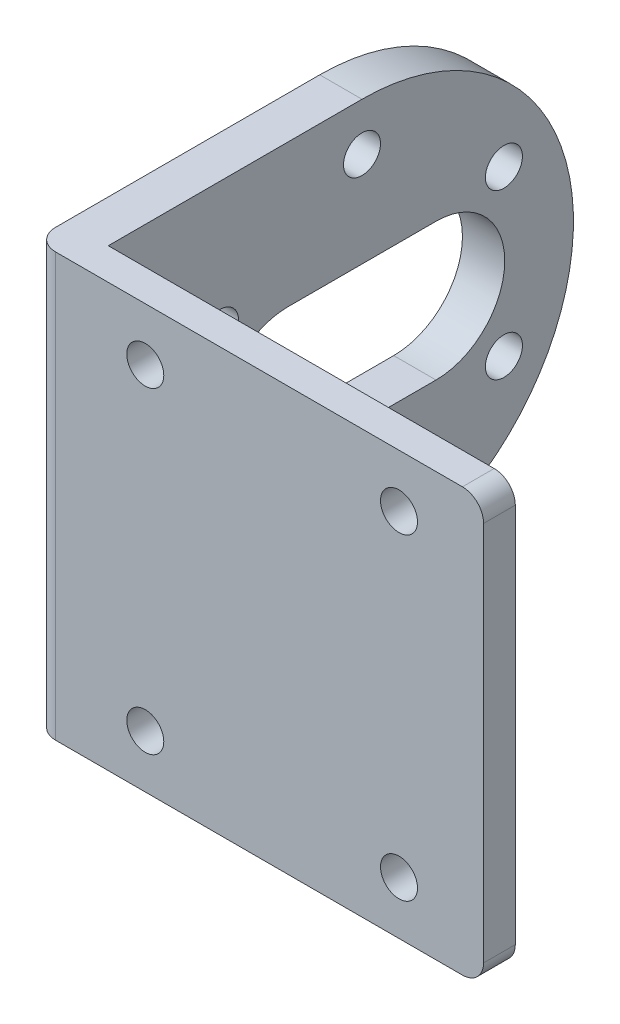
ISO-10303-21;
HEADER;
FILE_DESCRIPTION(('STEP AP214'),'2;1');
FILE_NAME('part.step','',(''),(''),'','','');
FILE_SCHEMA(('AUTOMOTIVE_DESIGN { 1 0 10303 214 1 1 1 1 }'));
ENDSEC;
DATA;
#1=APPLICATION_CONTEXT('core data for automotive mechanical design processes');
#2=APPLICATION_PROTOCOL_DEFINITION('international standard','automotive_design',2000,#1);
#3=PRODUCT_CONTEXT('',#1,'mechanical');
#4=PRODUCT('Part','Part','',(#3));
#5=PRODUCT_RELATED_PRODUCT_CATEGORY('part','',(#4));
#6=PRODUCT_DEFINITION_FORMATION('','',#4);
#7=PRODUCT_DEFINITION_CONTEXT('part definition',#1,'design');
#8=PRODUCT_DEFINITION('design','',#6,#7);
#9=PRODUCT_DEFINITION_SHAPE('','',#8);
#10=(LENGTH_UNIT() NAMED_UNIT(*) SI_UNIT(.MILLI.,.METRE.));
#11=(NAMED_UNIT(*) PLANE_ANGLE_UNIT() SI_UNIT($,.RADIAN.));
#12=(NAMED_UNIT(*) SI_UNIT($,.STERADIAN.) SOLID_ANGLE_UNIT());
#13=UNCERTAINTY_MEASURE_WITH_UNIT(LENGTH_MEASURE(1.E-05),#10,'distance_accuracy_value','');
#14=(GEOMETRIC_REPRESENTATION_CONTEXT(3) GLOBAL_UNCERTAINTY_ASSIGNED_CONTEXT((#13)) GLOBAL_UNIT_ASSIGNED_CONTEXT((#10,
#11,#12)) REPRESENTATION_CONTEXT('',''));
#15=CARTESIAN_POINT('',(0.,0.,0.));
#16=DIRECTION('',(0.,0.,1.));
#17=DIRECTION('',(1.,0.,0.));
#18=AXIS2_PLACEMENT_3D('',#15,#16,#17);
#19=CARTESIAN_POINT('',(3.,40.,-3.));
#20=DIRECTION('',(0.,0.,1.));
#21=DIRECTION('',(1.,0.,0.));
#22=AXIS2_PLACEMENT_3D('',#19,#20,#21);
#23=PLANE('',#22);
#24=CARTESIAN_POINT('',(34.5,35.,-3.));
#25=DIRECTION('',(0.,0.,1.));
#26=DIRECTION('',(1.,0.,0.));
#27=AXIS2_PLACEMENT_3D('',#24,#25,#26);
#28=CIRCLE('',#27,1.74999999999999);
#29=CARTESIAN_POINT('',(36.25,35.,-3.));
#30=VERTEX_POINT('',#29);
#31=EDGE_CURVE('E412',#30,#30,#28,.F.);
#32=ORIENTED_EDGE('',*,*,#31,.F.);
#33=EDGE_LOOP('',(#32));
#34=FACE_BOUND('',#33,.T.);
#35=CARTESIAN_POINT('',(10.5,4.99999999999983,-3.));
#36=DIRECTION('',(0.,0.,1.));
#37=DIRECTION('',(1.,0.,0.));
#38=AXIS2_PLACEMENT_3D('',#35,#36,#37);
#39=CIRCLE('',#38,1.75);
#40=CARTESIAN_POINT('',(12.25,4.99999999999983,-3.));
#41=VERTEX_POINT('',#40);
#42=EDGE_CURVE('E419',#41,#41,#39,.F.);
#43=ORIENTED_EDGE('',*,*,#42,.F.);
#44=EDGE_LOOP('',(#43));
#45=FACE_BOUND('',#44,.T.);
#46=CARTESIAN_POINT('',(10.5,34.9999999999998,-3.));
#47=DIRECTION('',(0.,0.,1.));
#48=DIRECTION('',(1.,0.,0.));
#49=AXIS2_PLACEMENT_3D('',#46,#47,#48);
#50=CIRCLE('',#49,1.74999999999999);
#51=CARTESIAN_POINT('',(12.25,34.9999999999998,-3.));
#52=VERTEX_POINT('',#51);
#53=EDGE_CURVE('E430',#52,#52,#50,.F.);
#54=ORIENTED_EDGE('',*,*,#53,.F.);
#55=EDGE_LOOP('',(#54));
#56=FACE_BOUND('',#55,.T.);
#57=CARTESIAN_POINT('',(34.5,5.,-3.));
#58=DIRECTION('',(0.,0.,1.));
#59=DIRECTION('',(1.,0.,0.));
#60=AXIS2_PLACEMENT_3D('',#57,#58,#59);
#61=CIRCLE('',#60,1.75);
#62=CARTESIAN_POINT('',(36.25,5.,-3.));
#63=VERTEX_POINT('',#62);
#64=EDGE_CURVE('E416',#63,#63,#61,.F.);
#65=ORIENTED_EDGE('',*,*,#64,.F.);
#66=EDGE_LOOP('',(#65));
#67=FACE_BOUND('',#66,.T.);
#68=DIRECTION('',(-1.,0.,0.));
#69=VECTOR('',#68,1.);
#70=CARTESIAN_POINT('',(3.,40.,-3.));
#71=LINE('',#70,#69);
#72=CARTESIAN_POINT('',(40.5,40.,-3.));
#73=VERTEX_POINT('',#72);
#74=CARTESIAN_POINT('',(3.99999999999999,40.,-3.));
#75=VERTEX_POINT('',#74);
#76=EDGE_CURVE('E198',#73,#75,#71,.T.);
#77=ORIENTED_EDGE('',*,*,#76,.F.);
#78=CARTESIAN_POINT('',(40.5,38.,-3.));
#79=DIRECTION('',(0.,0.,1.));
#80=DIRECTION('',(1.,0.,0.));
#81=AXIS2_PLACEMENT_3D('',#78,#79,#80);
#82=CIRCLE('',#81,2.);
#83=CARTESIAN_POINT('',(42.5,38.,-3.));
#84=VERTEX_POINT('',#83);
#85=EDGE_CURVE('E221',#73,#84,#82,.F.);
#86=ORIENTED_EDGE('',*,*,#85,.T.);
#87=DIRECTION('',(0.,-1.,0.));
#88=VECTOR('',#87,1.);
#89=CARTESIAN_POINT('',(42.5,40.,-3.));
#90=LINE('',#89,#88);
#91=CARTESIAN_POINT('',(42.5,2.,-3.));
#92=VERTEX_POINT('',#91);
#93=EDGE_CURVE('E204',#84,#92,#90,.T.);
#94=ORIENTED_EDGE('',*,*,#93,.T.);
#95=CARTESIAN_POINT('',(40.5,2.,-3.));
#96=DIRECTION('',(0.,0.,1.));
#97=DIRECTION('',(1.,0.,0.));
#98=AXIS2_PLACEMENT_3D('',#95,#96,#97);
#99=CIRCLE('',#98,2.);
#100=CARTESIAN_POINT('',(40.5,0.,-3.));
#101=VERTEX_POINT('',#100);
#102=EDGE_CURVE('E225',#92,#101,#99,.F.);
#103=ORIENTED_EDGE('',*,*,#102,.T.);
#104=DIRECTION('',(-1.,0.,0.));
#105=VECTOR('',#104,1.);
#106=CARTESIAN_POINT('',(3.,0.,-3.));
#107=LINE('',#106,#105);
#108=CARTESIAN_POINT('',(3.99999999999999,0.,-3.));
#109=VERTEX_POINT('',#108);
#110=EDGE_CURVE('E206',#101,#109,#107,.T.);
#111=ORIENTED_EDGE('',*,*,#110,.T.);
#112=DIRECTION('',(0.,-1.,0.));
#113=VECTOR('',#112,1.);
#114=CARTESIAN_POINT('',(4.,40.,-3.));
#115=LINE('',#114,#113);
#116=EDGE_CURVE('E181',#75,#109,#115,.T.);
#117=ORIENTED_EDGE('',*,*,#116,.F.);
#118=EDGE_LOOP('',(#77,#86,#94,#103,#111,#117));
#119=FACE_BOUND('',#118,.T.);
#120=ADVANCED_FACE('F40',(#34,#45,#56,#67,#119),#23,.F.);
#121=CARTESIAN_POINT('',(42.5,40.,0.));
#122=DIRECTION('',(0.,0.,-1.));
#123=DIRECTION('',(-1.,0.,0.));
#124=AXIS2_PLACEMENT_3D('',#121,#122,#123);
#125=PLANE('',#124);
#126=CARTESIAN_POINT('',(34.5,35.,0.));
#127=DIRECTION('',(0.,0.,1.));
#128=DIRECTION('',(-1.,0.,0.));
#129=AXIS2_PLACEMENT_3D('',#126,#127,#128);
#130=CIRCLE('',#129,1.74999999999999);
#131=CARTESIAN_POINT('',(32.75,35.,0.));
#132=VERTEX_POINT('',#131);
#133=EDGE_CURVE('E415',#132,#132,#130,.T.);
#134=ORIENTED_EDGE('',*,*,#133,.F.);
#135=EDGE_LOOP('',(#134));
#136=FACE_BOUND('',#135,.T.);
#137=CARTESIAN_POINT('',(10.5,4.99999999999983,0.));
#138=DIRECTION('',(0.,0.,1.));
#139=DIRECTION('',(1.,0.,0.));
#140=AXIS2_PLACEMENT_3D('',#137,#138,#139);
#141=CIRCLE('',#140,1.75);
#142=CARTESIAN_POINT('',(12.25,4.99999999999983,0.));
#143=VERTEX_POINT('',#142);
#144=EDGE_CURVE('E424',#143,#143,#141,.T.);
#145=ORIENTED_EDGE('',*,*,#144,.F.);
#146=EDGE_LOOP('',(#145));
#147=FACE_BOUND('',#146,.T.);
#148=CARTESIAN_POINT('',(10.5,34.9999999999998,0.));
#149=DIRECTION('',(0.,0.,1.));
#150=DIRECTION('',(-1.,0.,0.));
#151=AXIS2_PLACEMENT_3D('',#148,#149,#150);
#152=CIRCLE('',#151,1.74999999999999);
#153=CARTESIAN_POINT('',(8.75,34.9999999999998,0.));
#154=VERTEX_POINT('',#153);
#155=EDGE_CURVE('E501',#154,#154,#152,.T.);
#156=ORIENTED_EDGE('',*,*,#155,.F.);
#157=EDGE_LOOP('',(#156));
#158=FACE_BOUND('',#157,.T.);
#159=CARTESIAN_POINT('',(34.5,5.,0.));
#160=DIRECTION('',(0.,0.,1.));
#161=DIRECTION('',(1.,0.,0.));
#162=AXIS2_PLACEMENT_3D('',#159,#160,#161);
#163=CIRCLE('',#162,1.75);
#164=CARTESIAN_POINT('',(36.25,5.,0.));
#165=VERTEX_POINT('',#164);
#166=EDGE_CURVE('E414',#165,#165,#163,.T.);
#167=ORIENTED_EDGE('',*,*,#166,.F.);
#168=EDGE_LOOP('',(#167));
#169=FACE_BOUND('',#168,.T.);
#170=DIRECTION('',(0.,-1.,0.));
#171=VECTOR('',#170,1.);
#172=CARTESIAN_POINT('',(42.5,40.,0.));
#173=LINE('',#172,#171);
#174=CARTESIAN_POINT('',(42.5,38.,0.));
#175=VERTEX_POINT('',#174);
#176=CARTESIAN_POINT('',(42.5,2.,0.));
#177=VERTEX_POINT('',#176);
#178=EDGE_CURVE('E212',#175,#177,#173,.T.);
#179=ORIENTED_EDGE('',*,*,#178,.F.);
#180=CARTESIAN_POINT('',(40.5,38.,0.));
#181=DIRECTION('',(0.,0.,-1.));
#182=DIRECTION('',(-1.,0.,0.));
#183=AXIS2_PLACEMENT_3D('',#180,#181,#182);
#184=CIRCLE('',#183,2.);
#185=CARTESIAN_POINT('',(40.5,40.,0.));
#186=VERTEX_POINT('',#185);
#187=EDGE_CURVE('E237',#175,#186,#184,.F.);
#188=ORIENTED_EDGE('',*,*,#187,.T.);
#189=DIRECTION('',(1.,0.,0.));
#190=VECTOR('',#189,1.);
#191=CARTESIAN_POINT('',(42.5,40.,0.));
#192=LINE('',#191,#190);
#193=CARTESIAN_POINT('',(2.,40.,0.));
#194=VERTEX_POINT('',#193);
#195=EDGE_CURVE('E193',#194,#186,#192,.T.);
#196=ORIENTED_EDGE('',*,*,#195,.F.);
#197=DIRECTION('',(0.,-1.,0.));
#198=VECTOR('',#197,1.);
#199=CARTESIAN_POINT('',(2.,40.,0.));
#200=LINE('',#199,#198);
#201=CARTESIAN_POINT('',(2.,0.,0.));
#202=VERTEX_POINT('',#201);
#203=EDGE_CURVE('E231',#194,#202,#200,.T.);
#204=ORIENTED_EDGE('',*,*,#203,.T.);
#205=DIRECTION('',(1.,0.,0.));
#206=VECTOR('',#205,1.);
#207=CARTESIAN_POINT('',(42.5,0.,0.));
#208=LINE('',#207,#206);
#209=CARTESIAN_POINT('',(40.5,0.,0.));
#210=VERTEX_POINT('',#209);
#211=EDGE_CURVE('E195',#202,#210,#208,.T.);
#212=ORIENTED_EDGE('',*,*,#211,.T.);
#213=CARTESIAN_POINT('',(40.5,2.,0.));
#214=DIRECTION('',(0.,0.,-1.));
#215=DIRECTION('',(-1.,0.,0.));
#216=AXIS2_PLACEMENT_3D('',#213,#214,#215);
#217=CIRCLE('',#216,2.);
#218=EDGE_CURVE('E232',#210,#177,#217,.F.);
#219=ORIENTED_EDGE('',*,*,#218,.T.);
#220=EDGE_LOOP('',(#179,#188,#196,#204,#212,#219));
#221=FACE_BOUND('',#220,.T.);
#222=ADVANCED_FACE('F242',(#136,#147,#158,#169,#221),#125,.F.);
#223=CARTESIAN_POINT('',(42.5,40.,-3.));
#224=DIRECTION('',(-1.,0.,0.));
#225=DIRECTION('',(0.,0.,1.));
#226=AXIS2_PLACEMENT_3D('',#223,#224,#225);
#227=PLANE('',#226);
#228=ORIENTED_EDGE('',*,*,#93,.F.);
#229=DIRECTION('',(0.,0.,-1.));
#230=VECTOR('',#229,1.);
#231=CARTESIAN_POINT('',(42.5,38.,-3.));
#232=LINE('',#231,#230);
#233=EDGE_CURVE('E228',#84,#175,#232,.F.);
#234=ORIENTED_EDGE('',*,*,#233,.T.);
#235=ORIENTED_EDGE('',*,*,#178,.T.);
#236=DIRECTION('',(0.,0.,-1.));
#237=VECTOR('',#236,1.);
#238=CARTESIAN_POINT('',(42.5,2.,-3.));
#239=LINE('',#238,#237);
#240=EDGE_CURVE('E226',#177,#92,#239,.T.);
#241=ORIENTED_EDGE('',*,*,#240,.T.);
#242=EDGE_LOOP('',(#228,#234,#235,#241));
#243=FACE_BOUND('',#242,.T.);
#244=ADVANCED_FACE('F258',(#243),#227,.F.);
#245=CARTESIAN_POINT('',(0.,40.,0.));
#246=DIRECTION('',(1.,0.,0.));
#247=DIRECTION('',(0.,0.,-1.));
#248=AXIS2_PLACEMENT_3D('',#245,#246,#247);
#249=PLANE('',#248);
#250=CARTESIAN_POINT('',(0.,4.5,-27.));
#251=DIRECTION('',(1.,0.,0.));
#252=DIRECTION('',(0.,0.,-1.));
#253=AXIS2_PLACEMENT_3D('',#250,#251,#252);
#254=CIRCLE('',#253,1.75);
#255=CARTESIAN_POINT('',(0.,4.5,-28.75));
#256=VERTEX_POINT('',#255);
#257=EDGE_CURVE('E169',#256,#256,#254,.T.);
#258=ORIENTED_EDGE('',*,*,#257,.T.);
#259=EDGE_LOOP('',(#258));
#260=FACE_BOUND('',#259,.T.);
#261=CARTESIAN_POINT('',(0.,12.2499999999998,-40.4233937586587));
#262=DIRECTION('',(1.,0.,0.));
#263=DIRECTION('',(0.,0.,-1.));
#264=AXIS2_PLACEMENT_3D('',#261,#262,#263);
#265=CIRCLE('',#264,1.75);
#266=CARTESIAN_POINT('',(0.,12.2499999999998,-42.1733937586587));
#267=VERTEX_POINT('',#266);
#268=EDGE_CURVE('E438',#267,#267,#265,.T.);
#269=ORIENTED_EDGE('',*,*,#268,.T.);
#270=EDGE_LOOP('',(#269));
#271=FACE_BOUND('',#270,.T.);
#272=CARTESIAN_POINT('',(0.,27.7499999999999,-40.4233937586589));
#273=DIRECTION('',(1.,0.,0.));
#274=DIRECTION('',(0.,0.,-1.));
#275=AXIS2_PLACEMENT_3D('',#272,#273,#274);
#276=CIRCLE('',#275,1.75);
#277=CARTESIAN_POINT('',(0.,27.7499999999999,-42.1733937586589));
#278=VERTEX_POINT('',#277);
#279=EDGE_CURVE('E458',#278,#278,#276,.T.);
#280=ORIENTED_EDGE('',*,*,#279,.T.);
#281=EDGE_LOOP('',(#280));
#282=FACE_BOUND('',#281,.T.);
#283=CARTESIAN_POINT('',(0.,35.5,-27.0000000000001));
#284=DIRECTION('',(1.,0.,0.));
#285=DIRECTION('',(0.,0.,-1.));
#286=AXIS2_PLACEMENT_3D('',#283,#284,#285);
#287=CIRCLE('',#286,1.75);
#288=CARTESIAN_POINT('',(0.,35.5,-28.7500000000001));
#289=VERTEX_POINT('',#288);
#290=EDGE_CURVE('E454',#289,#289,#287,.T.);
#291=ORIENTED_EDGE('',*,*,#290,.T.);
#292=EDGE_LOOP('',(#291));
#293=FACE_BOUND('',#292,.T.);
#294=CARTESIAN_POINT('',(0.,27.7500000000001,-13.5766062413412));
#295=DIRECTION('',(1.,0.,0.));
#296=DIRECTION('',(0.,0.,-1.));
#297=AXIS2_PLACEMENT_3D('',#294,#295,#296);
#298=CIRCLE('',#297,1.75);
#299=CARTESIAN_POINT('',(0.,27.7500000000001,-15.3266062413412));
#300=VERTEX_POINT('',#299);
#301=EDGE_CURVE('E448',#300,#300,#298,.T.);
#302=ORIENTED_EDGE('',*,*,#301,.T.);
#303=EDGE_LOOP('',(#302));
#304=FACE_BOUND('',#303,.T.);
#305=CARTESIAN_POINT('',(0.,12.25,-13.5766062413412));
#306=DIRECTION('',(1.,0.,0.));
#307=DIRECTION('',(0.,0.,-1.));
#308=AXIS2_PLACEMENT_3D('',#305,#306,#307);
#309=CIRCLE('',#308,1.75);
#310=CARTESIAN_POINT('',(0.,12.25,-15.3266062413412));
#311=VERTEX_POINT('',#310);
#312=EDGE_CURVE('E437',#311,#311,#309,.T.);
#313=ORIENTED_EDGE('',*,*,#312,.T.);
#314=EDGE_LOOP('',(#313));
#315=FACE_BOUND('',#314,.T.);
#316=DIRECTION('',(0.,0.,-1.));
#317=VECTOR('',#316,1.);
#318=CARTESIAN_POINT('',(0.,13.5,-20.));
#319=LINE('',#318,#317);
#320=CARTESIAN_POINT('',(0.,13.5,-20.));
#321=VERTEX_POINT('',#320);
#322=CARTESIAN_POINT('',(0.,13.5,-34.));
#323=VERTEX_POINT('',#322);
#324=EDGE_CURVE('E142',#321,#323,#319,.T.);
#325=ORIENTED_EDGE('',*,*,#324,.T.);
#326=CARTESIAN_POINT('',(0.,20.,-34.));
#327=DIRECTION('',(1.,0.,0.));
#328=DIRECTION('',(0.,0.,1.));
#329=AXIS2_PLACEMENT_3D('',#326,#327,#328);
#330=CIRCLE('',#329,6.5);
#331=CARTESIAN_POINT('',(0.,26.5,-34.));
#332=VERTEX_POINT('',#331);
#333=EDGE_CURVE('E133',#323,#332,#330,.T.);
#334=ORIENTED_EDGE('',*,*,#333,.T.);
#335=DIRECTION('',(0.,0.,1.));
#336=VECTOR('',#335,1.);
#337=CARTESIAN_POINT('',(0.,26.5,-20.));
#338=LINE('',#337,#336);
#339=CARTESIAN_POINT('',(0.,26.5,-20.));
#340=VERTEX_POINT('',#339);
#341=EDGE_CURVE('E148',#332,#340,#338,.T.);
#342=ORIENTED_EDGE('',*,*,#341,.T.);
#343=CARTESIAN_POINT('',(0.,20.,-20.));
#344=DIRECTION('',(1.,0.,0.));
#345=DIRECTION('',(0.,0.,-1.));
#346=AXIS2_PLACEMENT_3D('',#343,#344,#345);
#347=CIRCLE('',#346,6.5);
#348=EDGE_CURVE('E147',#340,#321,#347,.T.);
#349=ORIENTED_EDGE('',*,*,#348,.T.);
#350=EDGE_LOOP('',(#325,#334,#342,#349));
#351=FACE_BOUND('',#350,.T.);
#352=DIRECTION('',(0.,0.,1.));
#353=VECTOR('',#352,1.);
#354=CARTESIAN_POINT('',(0.,0.,0.));
#355=LINE('',#354,#353);
#356=CARTESIAN_POINT('',(0.,0.,-27.));
#357=VERTEX_POINT('',#356);
#358=CARTESIAN_POINT('',(0.,0.,-2.));
#359=VERTEX_POINT('',#358);
#360=EDGE_CURVE('E197',#357,#359,#355,.T.);
#361=ORIENTED_EDGE('',*,*,#360,.T.);
#362=DIRECTION('',(0.,-1.,0.));
#363=VECTOR('',#362,1.);
#364=CARTESIAN_POINT('',(0.,40.,-2.));
#365=LINE('',#364,#363);
#366=CARTESIAN_POINT('',(0.,40.,-2.));
#367=VERTEX_POINT('',#366);
#368=EDGE_CURVE('E11',#359,#367,#365,.F.);
#369=ORIENTED_EDGE('',*,*,#368,.T.);
#370=DIRECTION('',(0.,0.,1.));
#371=VECTOR('',#370,1.);
#372=CARTESIAN_POINT('',(0.,40.,0.));
#373=LINE('',#372,#371);
#374=CARTESIAN_POINT('',(0.,40.,-27.));
#375=VERTEX_POINT('',#374);
#376=EDGE_CURVE('E203',#375,#367,#373,.T.);
#377=ORIENTED_EDGE('',*,*,#376,.F.);
#378=CARTESIAN_POINT('',(0.,20.,-27.));
#379=DIRECTION('',(1.,0.,0.));
#380=DIRECTION('',(0.,0.,1.));
#381=AXIS2_PLACEMENT_3D('',#378,#379,#380);
#382=CIRCLE('',#381,20.);
#383=EDGE_CURVE('E188',#357,#375,#382,.T.);
#384=ORIENTED_EDGE('',*,*,#383,.F.);
#385=EDGE_LOOP('',(#361,#369,#377,#384));
#386=FACE_BOUND('',#385,.T.);
#387=ADVANCED_FACE('F155',(#260,#271,#282,#293,#304,#315,#351,#386),#249,.F.);
#388=CARTESIAN_POINT('',(0.,40.,0.));
#389=DIRECTION('',(0.,-1.,0.));
#390=DIRECTION('',(0.,0.,-1.));
#391=AXIS2_PLACEMENT_3D('',#388,#389,#390);
#392=PLANE('',#391);
#393=ORIENTED_EDGE('',*,*,#195,.T.);
#394=DIRECTION('',(0.,0.,-1.));
#395=VECTOR('',#394,1.);
#396=CARTESIAN_POINT('',(40.5,40.,0.));
#397=LINE('',#396,#395);
#398=EDGE_CURVE('E218',#186,#73,#397,.T.);
#399=ORIENTED_EDGE('',*,*,#398,.T.);
#400=ORIENTED_EDGE('',*,*,#76,.T.);
#401=DIRECTION('',(0.,0.,1.));
#402=VECTOR('',#401,1.);
#403=CARTESIAN_POINT('',(3.99999999999999,40.,-27.));
#404=LINE('',#403,#402);
#405=CARTESIAN_POINT('',(3.99999999999999,40.,-27.));
#406=VERTEX_POINT('',#405);
#407=EDGE_CURVE('E179',#406,#75,#404,.T.);
#408=ORIENTED_EDGE('',*,*,#407,.F.);
#409=DIRECTION('',(-1.,0.,0.));
#410=VECTOR('',#409,1.);
#411=CARTESIAN_POINT('',(0.,40.,-27.));
#412=LINE('',#411,#410);
#413=EDGE_CURVE('E200',#406,#375,#412,.T.);
#414=ORIENTED_EDGE('',*,*,#413,.T.);
#415=ORIENTED_EDGE('',*,*,#376,.T.);
#416=CARTESIAN_POINT('',(2.,40.,-2.));
#417=DIRECTION('',(0.,-1.,0.));
#418=DIRECTION('',(0.,0.,-1.));
#419=AXIS2_PLACEMENT_3D('',#416,#417,#418);
#420=CIRCLE('',#419,2.);
#421=EDGE_CURVE('E220',#367,#194,#420,.F.);
#422=ORIENTED_EDGE('',*,*,#421,.T.);
#423=EDGE_LOOP('',(#393,#399,#400,#408,#414,#415,#422));
#424=FACE_BOUND('',#423,.T.);
#425=ADVANCED_FACE('F248',(#424),#392,.F.);
#426=CARTESIAN_POINT('',(0.,0.,0.));
#427=DIRECTION('',(0.,-1.,0.));
#428=DIRECTION('',(0.,0.,-1.));
#429=AXIS2_PLACEMENT_3D('',#426,#427,#428);
#430=PLANE('',#429);
#431=ORIENTED_EDGE('',*,*,#110,.F.);
#432=DIRECTION('',(0.,0.,-1.));
#433=VECTOR('',#432,1.);
#434=CARTESIAN_POINT('',(40.5,0.,0.));
#435=LINE('',#434,#433);
#436=EDGE_CURVE('E44',#101,#210,#435,.F.);
#437=ORIENTED_EDGE('',*,*,#436,.T.);
#438=ORIENTED_EDGE('',*,*,#211,.F.);
#439=CARTESIAN_POINT('',(2.,0.,-2.));
#440=DIRECTION('',(0.,-1.,0.));
#441=DIRECTION('',(0.,0.,-1.));
#442=AXIS2_PLACEMENT_3D('',#439,#440,#441);
#443=CIRCLE('',#442,2.);
#444=EDGE_CURVE('E55',#202,#359,#443,.T.);
#445=ORIENTED_EDGE('',*,*,#444,.T.);
#446=ORIENTED_EDGE('',*,*,#360,.F.);
#447=DIRECTION('',(-1.,0.,0.));
#448=VECTOR('',#447,1.);
#449=CARTESIAN_POINT('',(0.,0.,-27.));
#450=LINE('',#449,#448);
#451=CARTESIAN_POINT('',(3.99999999999999,0.,-27.));
#452=VERTEX_POINT('',#451);
#453=EDGE_CURVE('E208',#452,#357,#450,.T.);
#454=ORIENTED_EDGE('',*,*,#453,.F.);
#455=DIRECTION('',(0.,0.,-1.));
#456=VECTOR('',#455,1.);
#457=CARTESIAN_POINT('',(4.,0.,-3.));
#458=LINE('',#457,#456);
#459=EDGE_CURVE('E186',#109,#452,#458,.T.);
#460=ORIENTED_EDGE('',*,*,#459,.F.);
#461=EDGE_LOOP('',(#431,#437,#438,#445,#446,#454,#460));
#462=FACE_BOUND('',#461,.T.);
#463=ADVANCED_FACE('F265',(#462),#430,.T.);
#464=CARTESIAN_POINT('',(0.,20.,-27.));
#465=DIRECTION('',(1.,0.,0.));
#466=DIRECTION('',(0.,0.,-1.));
#467=AXIS2_PLACEMENT_3D('',#464,#465,#466);
#468=CYLINDRICAL_SURFACE('',#467,20.);
#469=ORIENTED_EDGE('',*,*,#413,.F.);
#470=CARTESIAN_POINT('',(3.99999999999999,20.,-27.));
#471=DIRECTION('',(1.,0.,0.));
#472=DIRECTION('',(0.,0.,1.));
#473=AXIS2_PLACEMENT_3D('',#470,#471,#472);
#474=CIRCLE('',#473,20.);
#475=EDGE_CURVE('E173',#452,#406,#474,.T.);
#476=ORIENTED_EDGE('',*,*,#475,.F.);
#477=ORIENTED_EDGE('',*,*,#453,.T.);
#478=ORIENTED_EDGE('',*,*,#383,.T.);
#479=EDGE_LOOP('',(#469,#476,#477,#478));
#480=FACE_BOUND('',#479,.T.);
#481=ADVANCED_FACE('F270',(#480),#468,.T.);
#482=CARTESIAN_POINT('',(3.99999999999999,20.,-27.));
#483=DIRECTION('',(-1.,0.,0.));
#484=DIRECTION('',(0.,0.,1.));
#485=AXIS2_PLACEMENT_3D('',#482,#483,#484);
#486=PLANE('',#485);
#487=CARTESIAN_POINT('',(3.99999999999999,4.5,-27.));
#488=DIRECTION('',(1.,0.,0.));
#489=DIRECTION('',(0.,0.,-1.));
#490=AXIS2_PLACEMENT_3D('',#487,#488,#489);
#491=CIRCLE('',#490,1.75);
#492=CARTESIAN_POINT('',(3.99999999999999,4.5,-28.75));
#493=VERTEX_POINT('',#492);
#494=EDGE_CURVE('E434',#493,#493,#491,.T.);
#495=ORIENTED_EDGE('',*,*,#494,.F.);
#496=EDGE_LOOP('',(#495));
#497=FACE_BOUND('',#496,.T.);
#498=CARTESIAN_POINT('',(3.99999999999999,12.2499999999998,-40.4233937586587));
#499=DIRECTION('',(1.,0.,0.));
#500=DIRECTION('',(0.,0.,-1.));
#501=AXIS2_PLACEMENT_3D('',#498,#499,#500);
#502=CIRCLE('',#501,1.75);
#503=CARTESIAN_POINT('',(3.99999999999999,12.2499999999998,-42.1733937586587));
#504=VERTEX_POINT('',#503);
#505=EDGE_CURVE('E435',#504,#504,#502,.T.);
#506=ORIENTED_EDGE('',*,*,#505,.F.);
#507=EDGE_LOOP('',(#506));
#508=FACE_BOUND('',#507,.T.);
#509=CARTESIAN_POINT('',(3.99999999999999,27.7499999999999,-40.4233937586589));
#510=DIRECTION('',(1.,0.,0.));
#511=DIRECTION('',(0.,0.,-1.));
#512=AXIS2_PLACEMENT_3D('',#509,#510,#511);
#513=CIRCLE('',#512,1.75);
#514=CARTESIAN_POINT('',(3.99999999999999,27.7499999999999,-42.1733937586589));
#515=VERTEX_POINT('',#514);
#516=EDGE_CURVE('E161',#515,#515,#513,.T.);
#517=ORIENTED_EDGE('',*,*,#516,.F.);
#518=EDGE_LOOP('',(#517));
#519=FACE_BOUND('',#518,.T.);
#520=CARTESIAN_POINT('',(3.99999999999999,35.5,-27.0000000000001));
#521=DIRECTION('',(1.,0.,0.));
#522=DIRECTION('',(0.,0.,-1.));
#523=AXIS2_PLACEMENT_3D('',#520,#521,#522);
#524=CIRCLE('',#523,1.75);
#525=CARTESIAN_POINT('',(3.99999999999999,35.5,-28.7500000000001));
#526=VERTEX_POINT('',#525);
#527=EDGE_CURVE('E456',#526,#526,#524,.T.);
#528=ORIENTED_EDGE('',*,*,#527,.F.);
#529=EDGE_LOOP('',(#528));
#530=FACE_BOUND('',#529,.T.);
#531=CARTESIAN_POINT('',(3.99999999999999,27.7500000000001,-13.5766062413412));
#532=DIRECTION('',(1.,0.,0.));
#533=DIRECTION('',(0.,0.,-1.));
#534=AXIS2_PLACEMENT_3D('',#531,#532,#533);
#535=CIRCLE('',#534,1.75);
#536=CARTESIAN_POINT('',(3.99999999999999,27.7500000000001,-15.3266062413412));
#537=VERTEX_POINT('',#536);
#538=EDGE_CURVE('E455',#537,#537,#535,.T.);
#539=ORIENTED_EDGE('',*,*,#538,.F.);
#540=EDGE_LOOP('',(#539));
#541=FACE_BOUND('',#540,.T.);
#542=CARTESIAN_POINT('',(3.99999999999999,12.25,-13.5766062413412));
#543=DIRECTION('',(1.,0.,0.));
#544=DIRECTION('',(0.,0.,-1.));
#545=AXIS2_PLACEMENT_3D('',#542,#543,#544);
#546=CIRCLE('',#545,1.75);
#547=CARTESIAN_POINT('',(3.99999999999999,12.25,-15.3266062413412));
#548=VERTEX_POINT('',#547);
#549=EDGE_CURVE('E446',#548,#548,#546,.T.);
#550=ORIENTED_EDGE('',*,*,#549,.F.);
#551=EDGE_LOOP('',(#550));
#552=FACE_BOUND('',#551,.T.);
#553=DIRECTION('',(0.,0.,1.));
#554=VECTOR('',#553,1.);
#555=CARTESIAN_POINT('',(3.99999999999999,26.5,-20.));
#556=LINE('',#555,#554);
#557=CARTESIAN_POINT('',(3.99999999999999,26.5,-34.));
#558=VERTEX_POINT('',#557);
#559=CARTESIAN_POINT('',(3.99999999999999,26.5,-20.));
#560=VERTEX_POINT('',#559);
#561=EDGE_CURVE('E170',#558,#560,#556,.T.);
#562=ORIENTED_EDGE('',*,*,#561,.F.);
#563=CARTESIAN_POINT('',(3.99999999999999,20.,-34.));
#564=DIRECTION('',(1.,0.,0.));
#565=DIRECTION('',(0.,0.,1.));
#566=AXIS2_PLACEMENT_3D('',#563,#564,#565);
#567=CIRCLE('',#566,6.5);
#568=CARTESIAN_POINT('',(3.99999999999999,13.5,-34.));
#569=VERTEX_POINT('',#568);
#570=EDGE_CURVE('E140',#569,#558,#567,.T.);
#571=ORIENTED_EDGE('',*,*,#570,.F.);
#572=DIRECTION('',(0.,0.,-1.));
#573=VECTOR('',#572,1.);
#574=CARTESIAN_POINT('',(3.99999999999999,13.5,-20.));
#575=LINE('',#574,#573);
#576=CARTESIAN_POINT('',(3.99999999999999,13.5,-20.));
#577=VERTEX_POINT('',#576);
#578=EDGE_CURVE('E154',#577,#569,#575,.T.);
#579=ORIENTED_EDGE('',*,*,#578,.F.);
#580=CARTESIAN_POINT('',(3.99999999999999,20.,-20.));
#581=DIRECTION('',(1.,0.,0.));
#582=DIRECTION('',(0.,0.,-1.));
#583=AXIS2_PLACEMENT_3D('',#580,#581,#582);
#584=CIRCLE('',#583,6.5);
#585=EDGE_CURVE('E158',#560,#577,#584,.T.);
#586=ORIENTED_EDGE('',*,*,#585,.F.);
#587=EDGE_LOOP('',(#562,#571,#579,#586));
#588=FACE_BOUND('',#587,.T.);
#589=ORIENTED_EDGE('',*,*,#475,.T.);
#590=ORIENTED_EDGE('',*,*,#407,.T.);
#591=ORIENTED_EDGE('',*,*,#116,.T.);
#592=ORIENTED_EDGE('',*,*,#459,.T.);
#593=EDGE_LOOP('',(#589,#590,#591,#592));
#594=FACE_BOUND('',#593,.T.);
#595=ADVANCED_FACE('F264',(#497,#508,#519,#530,#541,#552,#588,#594),#486,.F.);
#596=CARTESIAN_POINT('',(0.,20.,-34.));
#597=DIRECTION('',(1.,0.,0.));
#598=DIRECTION('',(0.,0.,-1.));
#599=AXIS2_PLACEMENT_3D('',#596,#597,#598);
#600=CYLINDRICAL_SURFACE('',#599,6.5);
#601=ORIENTED_EDGE('',*,*,#570,.T.);
#602=DIRECTION('',(1.,0.,0.));
#603=VECTOR('',#602,1.);
#604=CARTESIAN_POINT('',(0.,26.5,-34.));
#605=LINE('',#604,#603);
#606=EDGE_CURVE('E128',#332,#558,#605,.T.);
#607=ORIENTED_EDGE('',*,*,#606,.F.);
#608=ORIENTED_EDGE('',*,*,#333,.F.);
#609=DIRECTION('',(1.,0.,0.));
#610=VECTOR('',#609,1.);
#611=CARTESIAN_POINT('',(0.,13.5,-34.));
#612=LINE('',#611,#610);
#613=EDGE_CURVE('E172',#323,#569,#612,.T.);
#614=ORIENTED_EDGE('',*,*,#613,.T.);
#615=EDGE_LOOP('',(#601,#607,#608,#614));
#616=FACE_BOUND('',#615,.T.);
#617=ADVANCED_FACE('F132',(#616),#600,.F.);
#618=CARTESIAN_POINT('',(0.,13.5,-20.));
#619=DIRECTION('',(0.,-1.,0.));
#620=DIRECTION('',(0.,0.,-1.));
#621=AXIS2_PLACEMENT_3D('',#618,#619,#620);
#622=PLANE('',#621);
#623=ORIENTED_EDGE('',*,*,#578,.T.);
#624=ORIENTED_EDGE('',*,*,#613,.F.);
#625=ORIENTED_EDGE('',*,*,#324,.F.);
#626=DIRECTION('',(1.,0.,0.));
#627=VECTOR('',#626,1.);
#628=CARTESIAN_POINT('',(0.,13.5,-20.));
#629=LINE('',#628,#627);
#630=EDGE_CURVE('E175',#321,#577,#629,.T.);
#631=ORIENTED_EDGE('',*,*,#630,.T.);
#632=EDGE_LOOP('',(#623,#624,#625,#631));
#633=FACE_BOUND('',#632,.T.);
#634=ADVANCED_FACE('F332',(#633),#622,.F.);
#635=CARTESIAN_POINT('',(0.,20.,-20.));
#636=DIRECTION('',(1.,0.,0.));
#637=DIRECTION('',(0.,0.,-1.));
#638=AXIS2_PLACEMENT_3D('',#635,#636,#637);
#639=CYLINDRICAL_SURFACE('',#638,6.5);
#640=ORIENTED_EDGE('',*,*,#585,.T.);
#641=ORIENTED_EDGE('',*,*,#630,.F.);
#642=ORIENTED_EDGE('',*,*,#348,.F.);
#643=DIRECTION('',(1.,0.,0.));
#644=VECTOR('',#643,1.);
#645=CARTESIAN_POINT('',(0.,26.5,-20.));
#646=LINE('',#645,#644);
#647=EDGE_CURVE('E143',#340,#560,#646,.T.);
#648=ORIENTED_EDGE('',*,*,#647,.T.);
#649=EDGE_LOOP('',(#640,#641,#642,#648));
#650=FACE_BOUND('',#649,.T.);
#651=ADVANCED_FACE('F331',(#650),#639,.F.);
#652=CARTESIAN_POINT('',(0.,26.5,-20.));
#653=DIRECTION('',(0.,1.,0.));
#654=DIRECTION('',(0.,0.,1.));
#655=AXIS2_PLACEMENT_3D('',#652,#653,#654);
#656=PLANE('',#655);
#657=ORIENTED_EDGE('',*,*,#561,.T.);
#658=ORIENTED_EDGE('',*,*,#647,.F.);
#659=ORIENTED_EDGE('',*,*,#341,.F.);
#660=ORIENTED_EDGE('',*,*,#606,.T.);
#661=EDGE_LOOP('',(#657,#658,#659,#660));
#662=FACE_BOUND('',#661,.T.);
#663=ADVANCED_FACE('F150',(#662),#656,.F.);
#664=CARTESIAN_POINT('',(0.,12.25,-13.5766062413412));
#665=DIRECTION('',(1.,0.,0.));
#666=DIRECTION('',(0.,0.,-1.));
#667=AXIS2_PLACEMENT_3D('',#664,#665,#666);
#668=CYLINDRICAL_SURFACE('',#667,1.75);
#669=ORIENTED_EDGE('',*,*,#312,.F.);
#670=EDGE_LOOP('',(#669));
#671=FACE_BOUND('',#670,.T.);
#672=ORIENTED_EDGE('',*,*,#549,.T.);
#673=EDGE_LOOP('',(#672));
#674=FACE_BOUND('',#673,.T.);
#675=ADVANCED_FACE('F316',(#671,#674),#668,.F.);
#676=CARTESIAN_POINT('',(0.,27.7500000000001,-13.5766062413412));
#677=DIRECTION('',(1.,0.,0.));
#678=DIRECTION('',(0.,0.,-1.));
#679=AXIS2_PLACEMENT_3D('',#676,#677,#678);
#680=CYLINDRICAL_SURFACE('',#679,1.75);
#681=ORIENTED_EDGE('',*,*,#301,.F.);
#682=EDGE_LOOP('',(#681));
#683=FACE_BOUND('',#682,.T.);
#684=ORIENTED_EDGE('',*,*,#538,.T.);
#685=EDGE_LOOP('',(#684));
#686=FACE_BOUND('',#685,.T.);
#687=ADVANCED_FACE('F317',(#683,#686),#680,.F.);
#688=CARTESIAN_POINT('',(0.,35.5,-27.0000000000001));
#689=DIRECTION('',(1.,0.,0.));
#690=DIRECTION('',(0.,0.,-1.));
#691=AXIS2_PLACEMENT_3D('',#688,#689,#690);
#692=CYLINDRICAL_SURFACE('',#691,1.75);
#693=ORIENTED_EDGE('',*,*,#290,.F.);
#694=EDGE_LOOP('',(#693));
#695=FACE_BOUND('',#694,.T.);
#696=ORIENTED_EDGE('',*,*,#527,.T.);
#697=EDGE_LOOP('',(#696));
#698=FACE_BOUND('',#697,.T.);
#699=ADVANCED_FACE('F323',(#695,#698),#692,.F.);
#700=CARTESIAN_POINT('',(0.,27.7499999999999,-40.4233937586589));
#701=DIRECTION('',(1.,0.,0.));
#702=DIRECTION('',(0.,0.,-1.));
#703=AXIS2_PLACEMENT_3D('',#700,#701,#702);
#704=CYLINDRICAL_SURFACE('',#703,1.75);
#705=ORIENTED_EDGE('',*,*,#279,.F.);
#706=EDGE_LOOP('',(#705));
#707=FACE_BOUND('',#706,.T.);
#708=ORIENTED_EDGE('',*,*,#516,.T.);
#709=EDGE_LOOP('',(#708));
#710=FACE_BOUND('',#709,.T.);
#711=ADVANCED_FACE('F310',(#707,#710),#704,.F.);
#712=CARTESIAN_POINT('',(0.,12.2499999999998,-40.4233937586587));
#713=DIRECTION('',(1.,0.,0.));
#714=DIRECTION('',(0.,0.,-1.));
#715=AXIS2_PLACEMENT_3D('',#712,#713,#714);
#716=CYLINDRICAL_SURFACE('',#715,1.75);
#717=ORIENTED_EDGE('',*,*,#268,.F.);
#718=EDGE_LOOP('',(#717));
#719=FACE_BOUND('',#718,.T.);
#720=ORIENTED_EDGE('',*,*,#505,.T.);
#721=EDGE_LOOP('',(#720));
#722=FACE_BOUND('',#721,.T.);
#723=ADVANCED_FACE('F303',(#719,#722),#716,.F.);
#724=CARTESIAN_POINT('',(0.,4.5,-27.));
#725=DIRECTION('',(1.,0.,0.));
#726=DIRECTION('',(0.,0.,-1.));
#727=AXIS2_PLACEMENT_3D('',#724,#725,#726);
#728=CYLINDRICAL_SURFACE('',#727,1.75);
#729=ORIENTED_EDGE('',*,*,#257,.F.);
#730=EDGE_LOOP('',(#729));
#731=FACE_BOUND('',#730,.T.);
#732=ORIENTED_EDGE('',*,*,#494,.T.);
#733=EDGE_LOOP('',(#732));
#734=FACE_BOUND('',#733,.T.);
#735=ADVANCED_FACE('F299',(#731,#734),#728,.F.);
#736=CARTESIAN_POINT('',(40.5,38.,0.));
#737=DIRECTION('',(0.,0.,-1.));
#738=DIRECTION('',(-1.,0.,0.));
#739=AXIS2_PLACEMENT_3D('',#736,#737,#738);
#740=CYLINDRICAL_SURFACE('',#739,2.);
#741=ORIENTED_EDGE('',*,*,#187,.F.);
#742=ORIENTED_EDGE('',*,*,#233,.F.);
#743=ORIENTED_EDGE('',*,*,#85,.F.);
#744=ORIENTED_EDGE('',*,*,#398,.F.);
#745=EDGE_LOOP('',(#741,#742,#743,#744));
#746=FACE_BOUND('',#745,.T.);
#747=ADVANCED_FACE('F253',(#746),#740,.T.);
#748=CARTESIAN_POINT('',(40.5,2.,-3.));
#749=DIRECTION('',(0.,0.,1.));
#750=DIRECTION('',(1.,0.,0.));
#751=AXIS2_PLACEMENT_3D('',#748,#749,#750);
#752=CYLINDRICAL_SURFACE('',#751,2.);
#753=ORIENTED_EDGE('',*,*,#218,.F.);
#754=ORIENTED_EDGE('',*,*,#436,.F.);
#755=ORIENTED_EDGE('',*,*,#102,.F.);
#756=ORIENTED_EDGE('',*,*,#240,.F.);
#757=EDGE_LOOP('',(#753,#754,#755,#756));
#758=FACE_BOUND('',#757,.T.);
#759=ADVANCED_FACE('F257',(#758),#752,.T.);
#760=CARTESIAN_POINT('',(2.,40.,-2.));
#761=DIRECTION('',(0.,-1.,0.));
#762=DIRECTION('',(0.,0.,-1.));
#763=AXIS2_PLACEMENT_3D('',#760,#761,#762);
#764=CYLINDRICAL_SURFACE('',#763,2.);
#765=ORIENTED_EDGE('',*,*,#421,.F.);
#766=ORIENTED_EDGE('',*,*,#368,.F.);
#767=ORIENTED_EDGE('',*,*,#444,.F.);
#768=ORIENTED_EDGE('',*,*,#203,.F.);
#769=EDGE_LOOP('',(#765,#766,#767,#768));
#770=FACE_BOUND('',#769,.T.);
#771=ADVANCED_FACE('F39',(#770),#764,.T.);
#772=CARTESIAN_POINT('',(34.5,5.,-47.001));
#773=DIRECTION('',(0.,0.,1.));
#774=DIRECTION('',(1.,0.,0.));
#775=AXIS2_PLACEMENT_3D('',#772,#773,#774);
#776=CYLINDRICAL_SURFACE('',#775,1.75);
#777=ORIENTED_EDGE('',*,*,#166,.T.);
#778=EDGE_LOOP('',(#777));
#779=FACE_BOUND('',#778,.T.);
#780=ORIENTED_EDGE('',*,*,#64,.T.);
#781=EDGE_LOOP('',(#780));
#782=FACE_BOUND('',#781,.T.);
#783=ADVANCED_FACE('F273',(#779,#782),#776,.F.);
#784=CARTESIAN_POINT('',(10.5,34.9999999999998,-47.001));
#785=DIRECTION('',(0.,0.,1.));
#786=DIRECTION('',(1.,0.,0.));
#787=AXIS2_PLACEMENT_3D('',#784,#785,#786);
#788=CYLINDRICAL_SURFACE('',#787,1.74999999999999);
#789=ORIENTED_EDGE('',*,*,#155,.T.);
#790=EDGE_LOOP('',(#789));
#791=FACE_BOUND('',#790,.T.);
#792=ORIENTED_EDGE('',*,*,#53,.T.);
#793=EDGE_LOOP('',(#792));
#794=FACE_BOUND('',#793,.T.);
#795=ADVANCED_FACE('F278',(#791,#794),#788,.F.);
#796=CARTESIAN_POINT('',(10.5,4.99999999999983,-47.001));
#797=DIRECTION('',(0.,0.,1.));
#798=DIRECTION('',(1.,0.,0.));
#799=AXIS2_PLACEMENT_3D('',#796,#797,#798);
#800=CYLINDRICAL_SURFACE('',#799,1.75);
#801=ORIENTED_EDGE('',*,*,#144,.T.);
#802=EDGE_LOOP('',(#801));
#803=FACE_BOUND('',#802,.T.);
#804=ORIENTED_EDGE('',*,*,#42,.T.);
#805=EDGE_LOOP('',(#804));
#806=FACE_BOUND('',#805,.T.);
#807=ADVANCED_FACE('F391',(#803,#806),#800,.F.);
#808=CARTESIAN_POINT('',(34.5,35.,-47.001));
#809=DIRECTION('',(0.,0.,1.));
#810=DIRECTION('',(1.,0.,0.));
#811=AXIS2_PLACEMENT_3D('',#808,#809,#810);
#812=CYLINDRICAL_SURFACE('',#811,1.74999999999999);
#813=ORIENTED_EDGE('',*,*,#133,.T.);
#814=EDGE_LOOP('',(#813));
#815=FACE_BOUND('',#814,.T.);
#816=ORIENTED_EDGE('',*,*,#31,.T.);
#817=EDGE_LOOP('',(#816));
#818=FACE_BOUND('',#817,.T.);
#819=ADVANCED_FACE('F397',(#815,#818),#812,.F.);
#820=CLOSED_SHELL('',(#120,#222,#244,#387,#425,#463,#481,#595,#617,#634,#651,#663,#675,#687,
#699,#711,#723,#735,#747,#759,#771,#783,#795,#807,#819));
#821=MANIFOLD_SOLID_BREP('B2',#820);
#822=ADVANCED_BREP_SHAPE_REPRESENTATION('',(#18,#821),#14);
#823=SHAPE_DEFINITION_REPRESENTATION(#9,#822);
ENDSEC;
END-ISO-10303-21;
